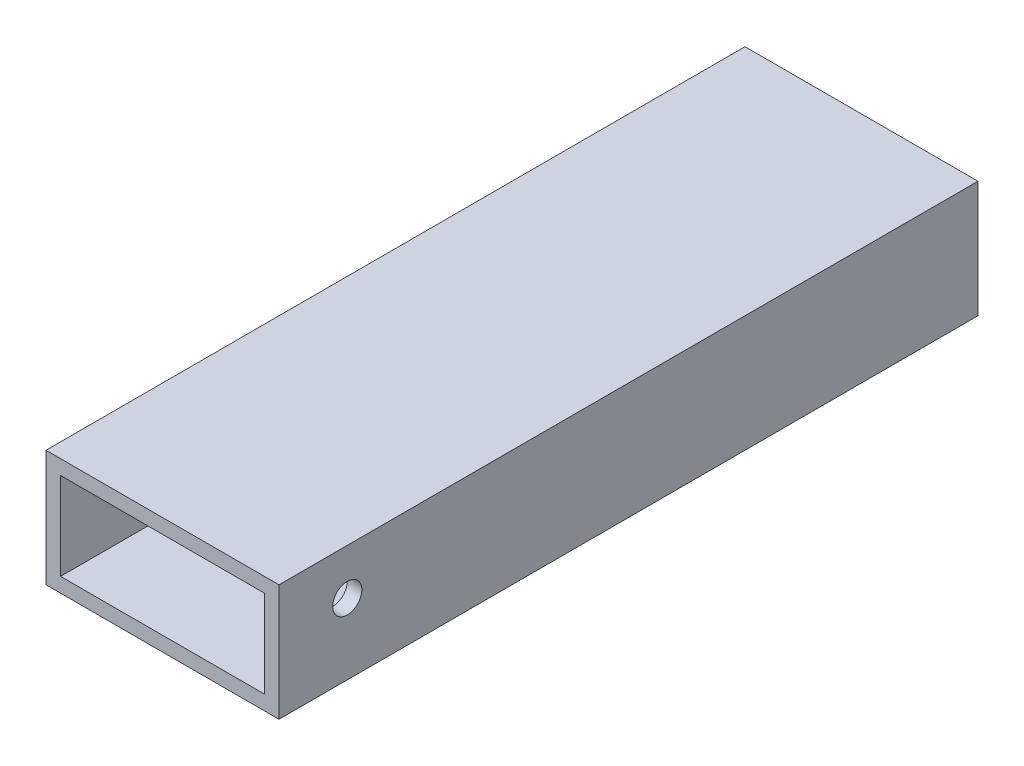
ISO-10303-21;
HEADER;
FILE_DESCRIPTION(('STEP AP214'),'2;1');
FILE_NAME('part.step','',(''),(''),'','','');
FILE_SCHEMA(('AUTOMOTIVE_DESIGN { 1 0 10303 214 1 1 1 1 }'));
ENDSEC;
DATA;
#1=APPLICATION_CONTEXT('core data for automotive mechanical design processes');
#2=APPLICATION_PROTOCOL_DEFINITION('international standard','automotive_design',2000,#1);
#3=PRODUCT_CONTEXT('',#1,'mechanical');
#4=PRODUCT('Part','Part','',(#3));
#5=PRODUCT_RELATED_PRODUCT_CATEGORY('part','',(#4));
#6=PRODUCT_DEFINITION_FORMATION('','',#4);
#7=PRODUCT_DEFINITION_CONTEXT('part definition',#1,'design');
#8=PRODUCT_DEFINITION('design','',#6,#7);
#9=PRODUCT_DEFINITION_SHAPE('','',#8);
#10=(LENGTH_UNIT() NAMED_UNIT(*) SI_UNIT(.MILLI.,.METRE.));
#11=(NAMED_UNIT(*) PLANE_ANGLE_UNIT() SI_UNIT($,.RADIAN.));
#12=(NAMED_UNIT(*) SI_UNIT($,.STERADIAN.) SOLID_ANGLE_UNIT());
#13=UNCERTAINTY_MEASURE_WITH_UNIT(LENGTH_MEASURE(1.E-05),#10,'distance_accuracy_value','');
#14=(GEOMETRIC_REPRESENTATION_CONTEXT(3) GLOBAL_UNCERTAINTY_ASSIGNED_CONTEXT((#13)) GLOBAL_UNIT_ASSIGNED_CONTEXT((#10,
#11,#12)) REPRESENTATION_CONTEXT('',''));
#15=CARTESIAN_POINT('',(0.,0.,0.));
#16=DIRECTION('',(0.,0.,1.));
#17=DIRECTION('',(1.,0.,0.));
#18=AXIS2_PLACEMENT_3D('',#15,#16,#17);
#19=CARTESIAN_POINT('',(0.,0.,152.4));
#20=DIRECTION('',(0.,0.,-1.));
#21=DIRECTION('',(-1.,0.,0.));
#22=AXIS2_PLACEMENT_3D('',#19,#20,#21);
#23=PLANE('',#22);
#24=DIRECTION('',(0.,1.,0.));
#25=VECTOR('',#24,1.);
#26=CARTESIAN_POINT('',(25.4,-12.7,152.4));
#27=LINE('',#26,#25);
#28=CARTESIAN_POINT('',(25.4,-12.7,152.4));
#29=VERTEX_POINT('',#28);
#30=CARTESIAN_POINT('',(25.4,12.7,152.4));
#31=VERTEX_POINT('',#30);
#32=EDGE_CURVE('E160',#29,#31,#27,.T.);
#33=ORIENTED_EDGE('',*,*,#32,.T.);
#34=DIRECTION('',(-1.,0.,0.));
#35=VECTOR('',#34,1.);
#36=CARTESIAN_POINT('',(-25.4,12.7,152.4));
#37=LINE('',#36,#35);
#38=CARTESIAN_POINT('',(-25.4,12.7,152.4));
#39=VERTEX_POINT('',#38);
#40=EDGE_CURVE('E163',#31,#39,#37,.T.);
#41=ORIENTED_EDGE('',*,*,#40,.T.);
#42=DIRECTION('',(0.,-1.,0.));
#43=VECTOR('',#42,1.);
#44=CARTESIAN_POINT('',(-25.4,-12.7,152.4));
#45=LINE('',#44,#43);
#46=CARTESIAN_POINT('',(-25.4,-12.7,152.4));
#47=VERTEX_POINT('',#46);
#48=EDGE_CURVE('E166',#39,#47,#45,.T.);
#49=ORIENTED_EDGE('',*,*,#48,.T.);
#50=DIRECTION('',(1.,0.,0.));
#51=VECTOR('',#50,1.);
#52=CARTESIAN_POINT('',(-25.4,-12.7,152.4));
#53=LINE('',#52,#51);
#54=EDGE_CURVE('E168',#47,#29,#53,.T.);
#55=ORIENTED_EDGE('',*,*,#54,.T.);
#56=EDGE_LOOP('',(#33,#41,#49,#55));
#57=FACE_BOUND('',#56,.T.);
#58=DIRECTION('',(0.,-1.,0.));
#59=VECTOR('',#58,1.);
#60=CARTESIAN_POINT('',(-22.225,-9.525,152.4));
#61=LINE('',#60,#59);
#62=CARTESIAN_POINT('',(-22.225,9.525,152.4));
#63=VERTEX_POINT('',#62);
#64=CARTESIAN_POINT('',(-22.225,-9.525,152.4));
#65=VERTEX_POINT('',#64);
#66=EDGE_CURVE('E114',#63,#65,#61,.T.);
#67=ORIENTED_EDGE('',*,*,#66,.F.);
#68=DIRECTION('',(-1.,0.,0.));
#69=VECTOR('',#68,1.);
#70=CARTESIAN_POINT('',(-22.225,9.525,152.4));
#71=LINE('',#70,#69);
#72=CARTESIAN_POINT('',(22.225,9.525,152.4));
#73=VERTEX_POINT('',#72);
#74=EDGE_CURVE('E137',#73,#63,#71,.T.);
#75=ORIENTED_EDGE('',*,*,#74,.F.);
#76=DIRECTION('',(0.,1.,0.));
#77=VECTOR('',#76,1.);
#78=CARTESIAN_POINT('',(22.225,-9.525,152.4));
#79=LINE('',#78,#77);
#80=CARTESIAN_POINT('',(22.225,-9.525,152.4));
#81=VERTEX_POINT('',#80);
#82=EDGE_CURVE('E135',#81,#73,#79,.T.);
#83=ORIENTED_EDGE('',*,*,#82,.F.);
#84=DIRECTION('',(1.,0.,0.));
#85=VECTOR('',#84,1.);
#86=CARTESIAN_POINT('',(-22.225,-9.525,152.4));
#87=LINE('',#86,#85);
#88=EDGE_CURVE('E122',#65,#81,#87,.T.);
#89=ORIENTED_EDGE('',*,*,#88,.F.);
#90=EDGE_LOOP('',(#67,#75,#83,#89));
#91=FACE_BOUND('',#90,.T.);
#92=ADVANCED_FACE('F39',(#57,#91),#23,.F.);
#93=CARTESIAN_POINT('',(0.,0.,0.));
#94=DIRECTION('',(0.,0.,-1.));
#95=DIRECTION('',(-1.,0.,0.));
#96=AXIS2_PLACEMENT_3D('',#93,#94,#95);
#97=PLANE('',#96);
#98=DIRECTION('',(0.,1.,0.));
#99=VECTOR('',#98,1.);
#100=CARTESIAN_POINT('',(25.4,-12.7,0.));
#101=LINE('',#100,#99);
#102=CARTESIAN_POINT('',(25.4,-12.7,0.));
#103=VERTEX_POINT('',#102);
#104=CARTESIAN_POINT('',(25.4,12.7,0.));
#105=VERTEX_POINT('',#104);
#106=EDGE_CURVE('E131',#103,#105,#101,.T.);
#107=ORIENTED_EDGE('',*,*,#106,.F.);
#108=DIRECTION('',(1.,0.,0.));
#109=VECTOR('',#108,1.);
#110=CARTESIAN_POINT('',(-25.4,-12.7,0.));
#111=LINE('',#110,#109);
#112=CARTESIAN_POINT('',(-25.4,-12.7,0.));
#113=VERTEX_POINT('',#112);
#114=EDGE_CURVE('E164',#113,#103,#111,.T.);
#115=ORIENTED_EDGE('',*,*,#114,.F.);
#116=DIRECTION('',(0.,-1.,0.));
#117=VECTOR('',#116,1.);
#118=CARTESIAN_POINT('',(-25.4,-12.7,0.));
#119=LINE('',#118,#117);
#120=CARTESIAN_POINT('',(-25.4,12.7,0.));
#121=VERTEX_POINT('',#120);
#122=EDGE_CURVE('E177',#121,#113,#119,.T.);
#123=ORIENTED_EDGE('',*,*,#122,.F.);
#124=DIRECTION('',(-1.,0.,0.));
#125=VECTOR('',#124,1.);
#126=CARTESIAN_POINT('',(-25.4,12.7,0.));
#127=LINE('',#126,#125);
#128=EDGE_CURVE('E174',#105,#121,#127,.T.);
#129=ORIENTED_EDGE('',*,*,#128,.F.);
#130=EDGE_LOOP('',(#107,#115,#123,#129));
#131=FACE_BOUND('',#130,.T.);
#132=DIRECTION('',(-1.,0.,0.));
#133=VECTOR('',#132,1.);
#134=CARTESIAN_POINT('',(-22.225,9.525,0.));
#135=LINE('',#134,#133);
#136=CARTESIAN_POINT('',(22.225,9.525,0.));
#137=VERTEX_POINT('',#136);
#138=CARTESIAN_POINT('',(-22.225,9.525,0.));
#139=VERTEX_POINT('',#138);
#140=EDGE_CURVE('E123',#137,#139,#135,.T.);
#141=ORIENTED_EDGE('',*,*,#140,.T.);
#142=DIRECTION('',(0.,-1.,0.));
#143=VECTOR('',#142,1.);
#144=CARTESIAN_POINT('',(-22.225,-9.525,0.));
#145=LINE('',#144,#143);
#146=CARTESIAN_POINT('',(-22.225,-9.525,0.));
#147=VERTEX_POINT('',#146);
#148=EDGE_CURVE('E67',#139,#147,#145,.T.);
#149=ORIENTED_EDGE('',*,*,#148,.T.);
#150=DIRECTION('',(1.,0.,0.));
#151=VECTOR('',#150,1.);
#152=CARTESIAN_POINT('',(-22.225,-9.525,0.));
#153=LINE('',#152,#151);
#154=CARTESIAN_POINT('',(22.225,-9.525,0.));
#155=VERTEX_POINT('',#154);
#156=EDGE_CURVE('E129',#147,#155,#153,.T.);
#157=ORIENTED_EDGE('',*,*,#156,.T.);
#158=DIRECTION('',(0.,1.,0.));
#159=VECTOR('',#158,1.);
#160=CARTESIAN_POINT('',(22.225,-9.525,0.));
#161=LINE('',#160,#159);
#162=EDGE_CURVE('E147',#155,#137,#161,.T.);
#163=ORIENTED_EDGE('',*,*,#162,.T.);
#164=EDGE_LOOP('',(#141,#149,#157,#163));
#165=FACE_BOUND('',#164,.T.);
#166=ADVANCED_FACE('F201',(#131,#165),#97,.T.);
#167=CARTESIAN_POINT('',(25.4,-12.7,152.4));
#168=DIRECTION('',(-1.,0.,0.));
#169=DIRECTION('',(0.,0.,1.));
#170=AXIS2_PLACEMENT_3D('',#167,#168,#169);
#171=PLANE('',#170);
#172=CARTESIAN_POINT('',(25.4,2.73865412148511,137.513740162323));
#173=DIRECTION('',(1.,0.,0.));
#174=DIRECTION('',(0.,0.,-1.));
#175=AXIS2_PLACEMENT_3D('',#172,#173,#174);
#176=CIRCLE('',#175,3.17500000000003);
#177=CARTESIAN_POINT('',(25.4,2.73865412148511,134.338740162323));
#178=VERTEX_POINT('',#177);
#179=EDGE_CURVE('E245',#178,#178,#176,.T.);
#180=ORIENTED_EDGE('',*,*,#179,.F.);
#181=EDGE_LOOP('',(#180));
#182=FACE_BOUND('',#181,.T.);
#183=ORIENTED_EDGE('',*,*,#106,.T.);
#184=DIRECTION('',(0.,0.,-1.));
#185=VECTOR('',#184,1.);
#186=CARTESIAN_POINT('',(25.4,12.7,152.4));
#187=LINE('',#186,#185);
#188=EDGE_CURVE('E11',#31,#105,#187,.T.);
#189=ORIENTED_EDGE('',*,*,#188,.F.);
#190=ORIENTED_EDGE('',*,*,#32,.F.);
#191=DIRECTION('',(0.,0.,-1.));
#192=VECTOR('',#191,1.);
#193=CARTESIAN_POINT('',(25.4,-12.7,152.4));
#194=LINE('',#193,#192);
#195=EDGE_CURVE('E170',#29,#103,#194,.T.);
#196=ORIENTED_EDGE('',*,*,#195,.T.);
#197=EDGE_LOOP('',(#183,#189,#190,#196));
#198=FACE_BOUND('',#197,.T.);
#199=ADVANCED_FACE('F41',(#182,#198),#171,.F.);
#200=CARTESIAN_POINT('',(-25.4,12.7,152.4));
#201=DIRECTION('',(0.,-1.,0.));
#202=DIRECTION('',(0.,0.,-1.));
#203=AXIS2_PLACEMENT_3D('',#200,#201,#202);
#204=PLANE('',#203);
#205=ORIENTED_EDGE('',*,*,#128,.T.);
#206=DIRECTION('',(0.,0.,-1.));
#207=VECTOR('',#206,1.);
#208=CARTESIAN_POINT('',(-25.4,12.7,152.4));
#209=LINE('',#208,#207);
#210=EDGE_CURVE('E49',#39,#121,#209,.T.);
#211=ORIENTED_EDGE('',*,*,#210,.F.);
#212=ORIENTED_EDGE('',*,*,#40,.F.);
#213=ORIENTED_EDGE('',*,*,#188,.T.);
#214=EDGE_LOOP('',(#205,#211,#212,#213));
#215=FACE_BOUND('',#214,.T.);
#216=ADVANCED_FACE('F211',(#215),#204,.F.);
#217=CARTESIAN_POINT('',(-25.4,-12.7,152.4));
#218=DIRECTION('',(1.,0.,0.));
#219=DIRECTION('',(0.,0.,-1.));
#220=AXIS2_PLACEMENT_3D('',#217,#218,#219);
#221=PLANE('',#220);
#222=CARTESIAN_POINT('',(-25.4,2.73865412148511,137.513740162323));
#223=DIRECTION('',(1.,0.,0.));
#224=DIRECTION('',(0.,0.,-1.));
#225=AXIS2_PLACEMENT_3D('',#222,#223,#224);
#226=CIRCLE('',#225,3.17500000000003);
#227=CARTESIAN_POINT('',(-25.4,2.73865412148511,134.338740162323));
#228=VERTEX_POINT('',#227);
#229=EDGE_CURVE('E243',#228,#228,#226,.T.);
#230=ORIENTED_EDGE('',*,*,#229,.T.);
#231=EDGE_LOOP('',(#230));
#232=FACE_BOUND('',#231,.T.);
#233=ORIENTED_EDGE('',*,*,#122,.T.);
#234=DIRECTION('',(0.,0.,-1.));
#235=VECTOR('',#234,1.);
#236=CARTESIAN_POINT('',(-25.4,-12.7,152.4));
#237=LINE('',#236,#235);
#238=EDGE_CURVE('E185',#47,#113,#237,.T.);
#239=ORIENTED_EDGE('',*,*,#238,.F.);
#240=ORIENTED_EDGE('',*,*,#48,.F.);
#241=ORIENTED_EDGE('',*,*,#210,.T.);
#242=EDGE_LOOP('',(#233,#239,#240,#241));
#243=FACE_BOUND('',#242,.T.);
#244=ADVANCED_FACE('F195',(#232,#243),#221,.F.);
#245=CARTESIAN_POINT('',(-25.4,-12.7,152.4));
#246=DIRECTION('',(0.,1.,0.));
#247=DIRECTION('',(-1.,0.,0.));
#248=AXIS2_PLACEMENT_3D('',#245,#246,#247);
#249=PLANE('',#248);
#250=ORIENTED_EDGE('',*,*,#114,.T.);
#251=ORIENTED_EDGE('',*,*,#195,.F.);
#252=ORIENTED_EDGE('',*,*,#54,.F.);
#253=ORIENTED_EDGE('',*,*,#238,.T.);
#254=EDGE_LOOP('',(#250,#251,#252,#253));
#255=FACE_BOUND('',#254,.T.);
#256=ADVANCED_FACE('F205',(#255),#249,.F.);
#257=CARTESIAN_POINT('',(-22.225,-9.525,152.4));
#258=DIRECTION('',(1.,0.,0.));
#259=DIRECTION('',(0.,0.,-1.));
#260=AXIS2_PLACEMENT_3D('',#257,#258,#259);
#261=PLANE('',#260);
#262=CARTESIAN_POINT('',(-22.225,2.73865412148511,137.513740162323));
#263=DIRECTION('',(1.,0.,0.));
#264=DIRECTION('',(0.,0.,-1.));
#265=AXIS2_PLACEMENT_3D('',#262,#263,#264);
#266=CIRCLE('',#265,3.17500000000003);
#267=CARTESIAN_POINT('',(-22.225,2.73865412148511,134.338740162323));
#268=VERTEX_POINT('',#267);
#269=EDGE_CURVE('E144',#268,#268,#266,.T.);
#270=ORIENTED_EDGE('',*,*,#269,.F.);
#271=EDGE_LOOP('',(#270));
#272=FACE_BOUND('',#271,.T.);
#273=ORIENTED_EDGE('',*,*,#148,.F.);
#274=DIRECTION('',(0.,0.,-1.));
#275=VECTOR('',#274,1.);
#276=CARTESIAN_POINT('',(-22.225,9.525,152.4));
#277=LINE('',#276,#275);
#278=EDGE_CURVE('E118',#63,#139,#277,.T.);
#279=ORIENTED_EDGE('',*,*,#278,.F.);
#280=ORIENTED_EDGE('',*,*,#66,.T.);
#281=DIRECTION('',(0.,0.,-1.));
#282=VECTOR('',#281,1.);
#283=CARTESIAN_POINT('',(-22.225,-9.525,152.4));
#284=LINE('',#283,#282);
#285=EDGE_CURVE('E117',#65,#147,#284,.T.);
#286=ORIENTED_EDGE('',*,*,#285,.T.);
#287=EDGE_LOOP('',(#273,#279,#280,#286));
#288=FACE_BOUND('',#287,.T.);
#289=ADVANCED_FACE('F116',(#272,#288),#261,.T.);
#290=CARTESIAN_POINT('',(-22.225,-9.525,152.4));
#291=DIRECTION('',(0.,1.,0.));
#292=DIRECTION('',(0.,0.,1.));
#293=AXIS2_PLACEMENT_3D('',#290,#291,#292);
#294=PLANE('',#293);
#295=ORIENTED_EDGE('',*,*,#156,.F.);
#296=ORIENTED_EDGE('',*,*,#285,.F.);
#297=ORIENTED_EDGE('',*,*,#88,.T.);
#298=DIRECTION('',(0.,0.,-1.));
#299=VECTOR('',#298,1.);
#300=CARTESIAN_POINT('',(22.225,-9.525,152.4));
#301=LINE('',#300,#299);
#302=EDGE_CURVE('E132',#81,#155,#301,.T.);
#303=ORIENTED_EDGE('',*,*,#302,.T.);
#304=EDGE_LOOP('',(#295,#296,#297,#303));
#305=FACE_BOUND('',#304,.T.);
#306=ADVANCED_FACE('F126',(#305),#294,.T.);
#307=CARTESIAN_POINT('',(22.225,-9.525,152.4));
#308=DIRECTION('',(-1.,0.,0.));
#309=DIRECTION('',(0.,-1.,0.));
#310=AXIS2_PLACEMENT_3D('',#307,#308,#309);
#311=PLANE('',#310);
#312=CARTESIAN_POINT('',(22.225,2.73865412148511,137.513740162323));
#313=DIRECTION('',(-1.,0.,0.));
#314=DIRECTION('',(0.,-1.,0.));
#315=AXIS2_PLACEMENT_3D('',#312,#313,#314);
#316=CIRCLE('',#315,3.17500000000003);
#317=CARTESIAN_POINT('',(22.225,-0.436345878514919,137.513740162323));
#318=VERTEX_POINT('',#317);
#319=EDGE_CURVE('E43',#318,#318,#316,.T.);
#320=ORIENTED_EDGE('',*,*,#319,.F.);
#321=EDGE_LOOP('',(#320));
#322=FACE_BOUND('',#321,.T.);
#323=ORIENTED_EDGE('',*,*,#162,.F.);
#324=ORIENTED_EDGE('',*,*,#302,.F.);
#325=ORIENTED_EDGE('',*,*,#82,.T.);
#326=DIRECTION('',(0.,0.,-1.));
#327=VECTOR('',#326,1.);
#328=CARTESIAN_POINT('',(22.225,9.525,152.4));
#329=LINE('',#328,#327);
#330=EDGE_CURVE('E56',#73,#137,#329,.T.);
#331=ORIENTED_EDGE('',*,*,#330,.T.);
#332=EDGE_LOOP('',(#323,#324,#325,#331));
#333=FACE_BOUND('',#332,.T.);
#334=ADVANCED_FACE('F238',(#322,#333),#311,.T.);
#335=CARTESIAN_POINT('',(-22.225,9.525,152.4));
#336=DIRECTION('',(0.,-1.,0.));
#337=DIRECTION('',(0.,0.,-1.));
#338=AXIS2_PLACEMENT_3D('',#335,#336,#337);
#339=PLANE('',#338);
#340=ORIENTED_EDGE('',*,*,#140,.F.);
#341=ORIENTED_EDGE('',*,*,#330,.F.);
#342=ORIENTED_EDGE('',*,*,#74,.T.);
#343=ORIENTED_EDGE('',*,*,#278,.T.);
#344=EDGE_LOOP('',(#340,#341,#342,#343));
#345=FACE_BOUND('',#344,.T.);
#346=ADVANCED_FACE('F258',(#345),#339,.T.);
#347=CARTESIAN_POINT('',(-25.4,2.73865412148511,137.513740162323));
#348=DIRECTION('',(1.,0.,0.));
#349=DIRECTION('',(0.,0.,-1.));
#350=AXIS2_PLACEMENT_3D('',#347,#348,#349);
#351=CYLINDRICAL_SURFACE('',#350,3.17500000000003);
#352=ORIENTED_EDGE('',*,*,#319,.T.);
#353=EDGE_LOOP('',(#352));
#354=FACE_BOUND('',#353,.T.);
#355=ORIENTED_EDGE('',*,*,#179,.T.);
#356=EDGE_LOOP('',(#355));
#357=FACE_BOUND('',#356,.T.);
#358=ADVANCED_FACE('F253',(#354,#357),#351,.F.);
#359=ORIENTED_EDGE('',*,*,#269,.T.);
#360=EDGE_LOOP('',(#359));
#361=FACE_BOUND('',#360,.T.);
#362=ORIENTED_EDGE('',*,*,#229,.F.);
#363=EDGE_LOOP('',(#362));
#364=FACE_BOUND('',#363,.T.);
#365=ADVANCED_FACE('F251',(#361,#364),#351,.F.);
#366=CLOSED_SHELL('',(#92,#166,#199,#216,#244,#256,#289,#306,#334,#346,#358,#365));
#367=MANIFOLD_SOLID_BREP('B2',#366);
#368=ADVANCED_BREP_SHAPE_REPRESENTATION('',(#18,#367),#14);
#369=SHAPE_DEFINITION_REPRESENTATION(#9,#368);
ENDSEC;
END-ISO-10303-21;
